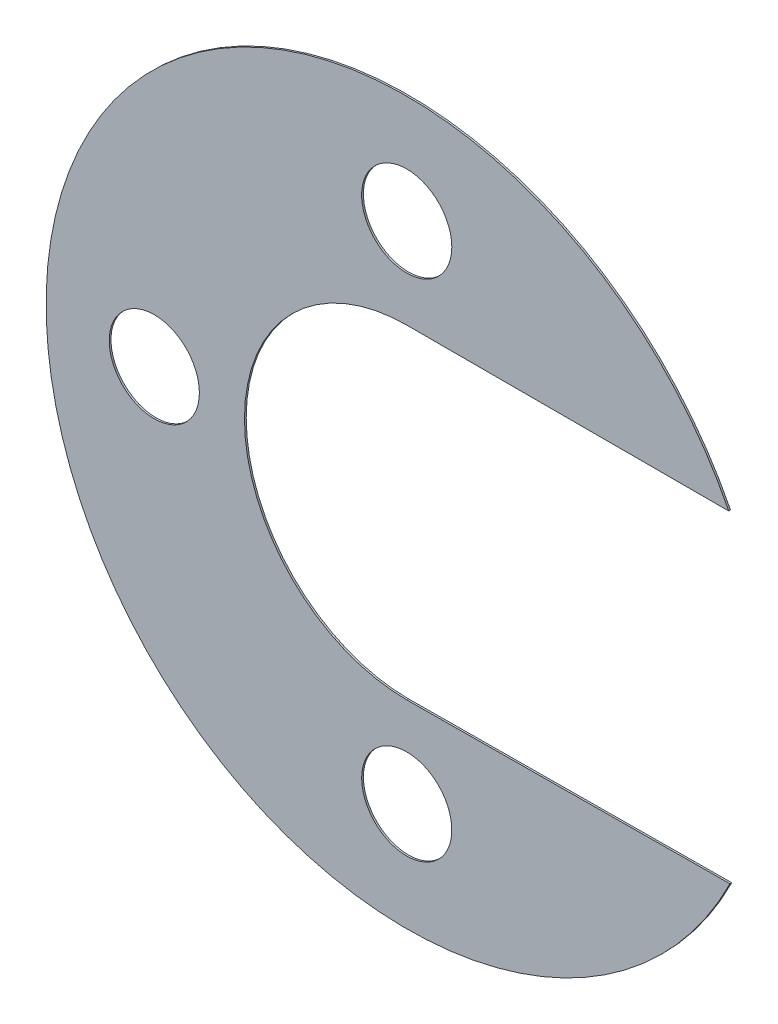
ISO-10303-21;
HEADER;
FILE_DESCRIPTION(('STEP AP214'),'2;1');
FILE_NAME('part.step','',(''),(''),'','','');
FILE_SCHEMA(('AUTOMOTIVE_DESIGN { 1 0 10303 214 1 1 1 1 }'));
ENDSEC;
DATA;
#1=APPLICATION_CONTEXT('core data for automotive mechanical design processes');
#2=APPLICATION_PROTOCOL_DEFINITION('international standard','automotive_design',2000,#1);
#3=PRODUCT_CONTEXT('',#1,'mechanical');
#4=PRODUCT('Part','Part','',(#3));
#5=PRODUCT_RELATED_PRODUCT_CATEGORY('part','',(#4));
#6=PRODUCT_DEFINITION_FORMATION('','',#4);
#7=PRODUCT_DEFINITION_CONTEXT('part definition',#1,'design');
#8=PRODUCT_DEFINITION('design','',#6,#7);
#9=PRODUCT_DEFINITION_SHAPE('','',#8);
#10=(LENGTH_UNIT() NAMED_UNIT(*) SI_UNIT(.MILLI.,.METRE.));
#11=(NAMED_UNIT(*) PLANE_ANGLE_UNIT() SI_UNIT($,.RADIAN.));
#12=(NAMED_UNIT(*) SI_UNIT($,.STERADIAN.) SOLID_ANGLE_UNIT());
#13=UNCERTAINTY_MEASURE_WITH_UNIT(LENGTH_MEASURE(1.E-05),#10,'distance_accuracy_value','');
#14=(GEOMETRIC_REPRESENTATION_CONTEXT(3) GLOBAL_UNCERTAINTY_ASSIGNED_CONTEXT((#13)) GLOBAL_UNIT_ASSIGNED_CONTEXT((#10,
#11,#12)) REPRESENTATION_CONTEXT('',''));
#15=CARTESIAN_POINT('',(0.,0.,0.));
#16=DIRECTION('',(0.,0.,1.));
#17=DIRECTION('',(1.,0.,0.));
#18=AXIS2_PLACEMENT_3D('',#15,#16,#17);
#19=CARTESIAN_POINT('',(-2045.28845561244,-1097.8705063361,5.));
#20=DIRECTION('',(0.,0.,1.));
#21=DIRECTION('',(1.,0.,0.));
#22=AXIS2_PLACEMENT_3D('',#19,#20,#21);
#23=PLANE('',#22);
#24=CARTESIAN_POINT('',(-2045.28845561244,-386.670506336097,5.));
#25=DIRECTION('',(0.,0.,1.));
#26=DIRECTION('',(1.,0.,0.));
#27=AXIS2_PLACEMENT_3D('',#24,#25,#26);
#28=CIRCLE('',#27,126.999999999998);
#29=CARTESIAN_POINT('',(-1918.28845561245,-386.670506336097,5.));
#30=VERTEX_POINT('',#29);
#31=EDGE_CURVE('E115',#30,#30,#28,.T.);
#32=ORIENTED_EDGE('',*,*,#31,.F.);
#33=EDGE_LOOP('',(#32));
#34=FACE_BOUND('',#33,.T.);
#35=CARTESIAN_POINT('',(-2045.28845561244,-1097.8705063361,5.));
#36=DIRECTION('',(0.,0.,-1.));
#37=DIRECTION('',(1.,0.,0.));
#38=AXIS2_PLACEMENT_3D('',#35,#36,#37);
#39=CIRCLE('',#38,457.2);
#40=CARTESIAN_POINT('',(-2045.28845561244,-1555.0705063361,5.));
#41=VERTEX_POINT('',#40);
#42=CARTESIAN_POINT('',(-2045.28845561244,-640.670506336096,5.));
#43=VERTEX_POINT('',#42);
#44=EDGE_CURVE('E85',#41,#43,#39,.T.);
#45=ORIENTED_EDGE('',*,*,#44,.T.);
#46=DIRECTION('',(1.,0.,0.));
#47=VECTOR('',#46,1.);
#48=CARTESIAN_POINT('',(-2045.28845561244,-640.670506336096,5.));
#49=LINE('',#48,#47);
#50=CARTESIAN_POINT('',(-1137.97144375827,-640.670506336096,5.));
#51=VERTEX_POINT('',#50);
#52=EDGE_CURVE('E80',#43,#51,#49,.T.);
#53=ORIENTED_EDGE('',*,*,#52,.T.);
#54=CARTESIAN_POINT('',(-2045.28845561244,-1097.8705063361,5.));
#55=DIRECTION('',(0.,0.,1.));
#56=DIRECTION('',(1.,0.,0.));
#57=AXIS2_PLACEMENT_3D('',#54,#55,#56);
#58=CIRCLE('',#57,1016.);
#59=CARTESIAN_POINT('',(-1134.61767517985,-1548.35328033116,5.));
#60=VERTEX_POINT('',#59);
#61=EDGE_CURVE('E83',#51,#60,#58,.T.);
#62=ORIENTED_EDGE('',*,*,#61,.T.);
#63=DIRECTION('',(-0.999972797463594,-0.00737592928605857,0.));
#64=VECTOR('',#63,1.);
#65=CARTESIAN_POINT('',(-1134.61767517985,-1548.35328033116,5.));
#66=LINE('',#65,#64);
#67=EDGE_CURVE('E50',#60,#41,#66,.T.);
#68=ORIENTED_EDGE('',*,*,#67,.T.);
#69=EDGE_LOOP('',(#45,#53,#62,#68));
#70=FACE_BOUND('',#69,.T.);
#71=CARTESIAN_POINT('',(-2045.28845561244,-1809.0705063361,5.));
#72=DIRECTION('',(0.,0.,1.));
#73=DIRECTION('',(-1.,0.,0.));
#74=AXIS2_PLACEMENT_3D('',#71,#72,#73);
#75=CIRCLE('',#74,126.999999999998);
#76=CARTESIAN_POINT('',(-2172.28845561244,-1809.0705063361,5.));
#77=VERTEX_POINT('',#76);
#78=EDGE_CURVE('E100',#77,#77,#75,.T.);
#79=ORIENTED_EDGE('',*,*,#78,.F.);
#80=EDGE_LOOP('',(#79));
#81=FACE_BOUND('',#80,.T.);
#82=CARTESIAN_POINT('',(-2756.48845561244,-1097.8705063361,5.));
#83=DIRECTION('',(0.,0.,1.));
#84=DIRECTION('',(1.,0.,0.));
#85=AXIS2_PLACEMENT_3D('',#82,#83,#84);
#86=CIRCLE('',#85,126.999999999997);
#87=CARTESIAN_POINT('',(-2629.48845561245,-1097.8705063361,5.));
#88=VERTEX_POINT('',#87);
#89=EDGE_CURVE('E121',#88,#88,#86,.T.);
#90=ORIENTED_EDGE('',*,*,#89,.F.);
#91=EDGE_LOOP('',(#90));
#92=FACE_BOUND('',#91,.T.);
#93=ADVANCED_FACE('F33',(#34,#70,#81,#92),#23,.T.);
#94=CARTESIAN_POINT('',(-2045.28845561244,-1097.8705063361,0.));
#95=DIRECTION('',(0.,0.,1.));
#96=DIRECTION('',(1.,0.,0.));
#97=AXIS2_PLACEMENT_3D('',#94,#95,#96);
#98=PLANE('',#97);
#99=CARTESIAN_POINT('',(-2045.28845561244,-1097.8705063361,0.));
#100=DIRECTION('',(0.,0.,-1.));
#101=DIRECTION('',(1.,0.,0.));
#102=AXIS2_PLACEMENT_3D('',#99,#100,#101);
#103=CIRCLE('',#102,457.2);
#104=CARTESIAN_POINT('',(-2045.28845561244,-1555.0705063361,0.));
#105=VERTEX_POINT('',#104);
#106=CARTESIAN_POINT('',(-2045.28845561244,-640.670506336096,0.));
#107=VERTEX_POINT('',#106);
#108=EDGE_CURVE('E97',#105,#107,#103,.T.);
#109=ORIENTED_EDGE('',*,*,#108,.F.);
#110=DIRECTION('',(-0.999972797463594,-0.00737592928605857,0.));
#111=VECTOR('',#110,1.);
#112=CARTESIAN_POINT('',(-1134.61767517985,-1548.35328033116,0.));
#113=LINE('',#112,#111);
#114=CARTESIAN_POINT('',(-1134.61767517985,-1548.35328033116,0.));
#115=VERTEX_POINT('',#114);
#116=EDGE_CURVE('E73',#115,#105,#113,.T.);
#117=ORIENTED_EDGE('',*,*,#116,.F.);
#118=CARTESIAN_POINT('',(-2045.28845561244,-1097.8705063361,0.));
#119=DIRECTION('',(0.,0.,1.));
#120=DIRECTION('',(1.,0.,0.));
#121=AXIS2_PLACEMENT_3D('',#118,#119,#120);
#122=CIRCLE('',#121,1016.);
#123=CARTESIAN_POINT('',(-1137.97144375827,-640.670506336096,0.));
#124=VERTEX_POINT('',#123);
#125=EDGE_CURVE('E67',#124,#115,#122,.T.);
#126=ORIENTED_EDGE('',*,*,#125,.F.);
#127=DIRECTION('',(1.,0.,0.));
#128=VECTOR('',#127,1.);
#129=CARTESIAN_POINT('',(-2045.28845561244,-640.670506336096,0.));
#130=LINE('',#129,#128);
#131=EDGE_CURVE('E89',#107,#124,#130,.T.);
#132=ORIENTED_EDGE('',*,*,#131,.F.);
#133=EDGE_LOOP('',(#109,#117,#126,#132));
#134=FACE_BOUND('',#133,.T.);
#135=CARTESIAN_POINT('',(-2045.28845561244,-1809.0705063361,0.));
#136=DIRECTION('',(0.,0.,1.));
#137=DIRECTION('',(-1.,0.,0.));
#138=AXIS2_PLACEMENT_3D('',#135,#136,#137);
#139=CIRCLE('',#138,126.999999999998);
#140=CARTESIAN_POINT('',(-2172.28845561244,-1809.0705063361,0.));
#141=VERTEX_POINT('',#140);
#142=EDGE_CURVE('E112',#141,#141,#139,.T.);
#143=ORIENTED_EDGE('',*,*,#142,.T.);
#144=EDGE_LOOP('',(#143));
#145=FACE_BOUND('',#144,.T.);
#146=CARTESIAN_POINT('',(-2045.28845561244,-386.670506336097,0.));
#147=DIRECTION('',(0.,0.,1.));
#148=DIRECTION('',(1.,0.,0.));
#149=AXIS2_PLACEMENT_3D('',#146,#147,#148);
#150=CIRCLE('',#149,126.999999999998);
#151=CARTESIAN_POINT('',(-1918.28845561245,-386.670506336097,0.));
#152=VERTEX_POINT('',#151);
#153=EDGE_CURVE('E118',#152,#152,#150,.T.);
#154=ORIENTED_EDGE('',*,*,#153,.T.);
#155=EDGE_LOOP('',(#154));
#156=FACE_BOUND('',#155,.T.);
#157=CARTESIAN_POINT('',(-2756.48845561244,-1097.8705063361,0.));
#158=DIRECTION('',(0.,0.,1.));
#159=DIRECTION('',(1.,0.,0.));
#160=AXIS2_PLACEMENT_3D('',#157,#158,#159);
#161=CIRCLE('',#160,126.999999999997);
#162=CARTESIAN_POINT('',(-2629.48845561245,-1097.8705063361,0.));
#163=VERTEX_POINT('',#162);
#164=EDGE_CURVE('E124',#163,#163,#161,.T.);
#165=ORIENTED_EDGE('',*,*,#164,.T.);
#166=EDGE_LOOP('',(#165));
#167=FACE_BOUND('',#166,.T.);
#168=ADVANCED_FACE('F108',(#134,#145,#156,#167),#98,.F.);
#169=CARTESIAN_POINT('',(-2045.28845561244,-1097.8705063361,5.));
#170=DIRECTION('',(0.,0.,-1.));
#171=DIRECTION('',(-1.,0.,0.));
#172=AXIS2_PLACEMENT_3D('',#169,#170,#171);
#173=CYLINDRICAL_SURFACE('',#172,457.2);
#174=ORIENTED_EDGE('',*,*,#108,.T.);
#175=DIRECTION('',(0.,0.,-1.));
#176=VECTOR('',#175,1.);
#177=CARTESIAN_POINT('',(-2045.28845561244,-640.670506336096,5.));
#178=LINE('',#177,#176);
#179=EDGE_CURVE('E11',#43,#107,#178,.T.);
#180=ORIENTED_EDGE('',*,*,#179,.F.);
#181=ORIENTED_EDGE('',*,*,#44,.F.);
#182=DIRECTION('',(0.,0.,-1.));
#183=VECTOR('',#182,1.);
#184=CARTESIAN_POINT('',(-2045.28845561244,-1555.0705063361,5.));
#185=LINE('',#184,#183);
#186=EDGE_CURVE('E93',#41,#105,#185,.T.);
#187=ORIENTED_EDGE('',*,*,#186,.T.);
#188=EDGE_LOOP('',(#174,#180,#181,#187));
#189=FACE_BOUND('',#188,.T.);
#190=ADVANCED_FACE('F35',(#189),#173,.F.);
#191=CARTESIAN_POINT('',(-2045.28845561244,-640.670506336096,5.));
#192=DIRECTION('',(0.,1.,0.));
#193=DIRECTION('',(0.,0.,1.));
#194=AXIS2_PLACEMENT_3D('',#191,#192,#193);
#195=PLANE('',#194);
#196=ORIENTED_EDGE('',*,*,#131,.T.);
#197=DIRECTION('',(0.,0.,-1.));
#198=VECTOR('',#197,1.);
#199=CARTESIAN_POINT('',(-1137.97144375827,-640.670506336096,5.));
#200=LINE('',#199,#198);
#201=EDGE_CURVE('E42',#51,#124,#200,.T.);
#202=ORIENTED_EDGE('',*,*,#201,.F.);
#203=ORIENTED_EDGE('',*,*,#52,.F.);
#204=ORIENTED_EDGE('',*,*,#179,.T.);
#205=EDGE_LOOP('',(#196,#202,#203,#204));
#206=FACE_BOUND('',#205,.T.);
#207=ADVANCED_FACE('F88',(#206),#195,.F.);
#208=CARTESIAN_POINT('',(-2045.28845561244,-1097.8705063361,5.));
#209=DIRECTION('',(0.,0.,-1.));
#210=DIRECTION('',(-1.,0.,0.));
#211=AXIS2_PLACEMENT_3D('',#208,#209,#210);
#212=CYLINDRICAL_SURFACE('',#211,1016.);
#213=ORIENTED_EDGE('',*,*,#125,.T.);
#214=DIRECTION('',(0.,0.,-1.));
#215=VECTOR('',#214,1.);
#216=CARTESIAN_POINT('',(-1134.61767517985,-1548.35328033116,5.));
#217=LINE('',#216,#215);
#218=EDGE_CURVE('E90',#60,#115,#217,.T.);
#219=ORIENTED_EDGE('',*,*,#218,.F.);
#220=ORIENTED_EDGE('',*,*,#61,.F.);
#221=ORIENTED_EDGE('',*,*,#201,.T.);
#222=EDGE_LOOP('',(#213,#219,#220,#221));
#223=FACE_BOUND('',#222,.T.);
#224=ADVANCED_FACE('F91',(#223),#212,.T.);
#225=CARTESIAN_POINT('',(-1134.61767517985,-1548.35328033116,5.));
#226=DIRECTION('',(0.00737592928605857,-0.999972797463594,0.));
#227=DIRECTION('',(0.999972797463595,0.00737592928605857,0.));
#228=AXIS2_PLACEMENT_3D('',#225,#226,#227);
#229=PLANE('',#228);
#230=ORIENTED_EDGE('',*,*,#116,.T.);
#231=ORIENTED_EDGE('',*,*,#186,.F.);
#232=ORIENTED_EDGE('',*,*,#67,.F.);
#233=ORIENTED_EDGE('',*,*,#218,.T.);
#234=EDGE_LOOP('',(#230,#231,#232,#233));
#235=FACE_BOUND('',#234,.T.);
#236=ADVANCED_FACE('F105',(#235),#229,.F.);
#237=CARTESIAN_POINT('',(-2045.28845561244,-1809.0705063361,5.));
#238=DIRECTION('',(0.,0.,-1.));
#239=DIRECTION('',(-1.,0.,0.));
#240=AXIS2_PLACEMENT_3D('',#237,#238,#239);
#241=CYLINDRICAL_SURFACE('',#240,126.999999999998);
#242=ORIENTED_EDGE('',*,*,#78,.T.);
#243=EDGE_LOOP('',(#242));
#244=FACE_BOUND('',#243,.T.);
#245=ORIENTED_EDGE('',*,*,#142,.F.);
#246=EDGE_LOOP('',(#245));
#247=FACE_BOUND('',#246,.T.);
#248=ADVANCED_FACE('F142',(#244,#247),#241,.F.);
#249=CARTESIAN_POINT('',(-2045.28845561244,-386.670506336097,5.));
#250=DIRECTION('',(0.,0.,-1.));
#251=DIRECTION('',(-1.,0.,0.));
#252=AXIS2_PLACEMENT_3D('',#249,#250,#251);
#253=CYLINDRICAL_SURFACE('',#252,126.999999999998);
#254=ORIENTED_EDGE('',*,*,#31,.T.);
#255=EDGE_LOOP('',(#254));
#256=FACE_BOUND('',#255,.T.);
#257=ORIENTED_EDGE('',*,*,#153,.F.);
#258=EDGE_LOOP('',(#257));
#259=FACE_BOUND('',#258,.T.);
#260=ADVANCED_FACE('F188',(#256,#259),#253,.F.);
#261=CARTESIAN_POINT('',(-2756.48845561244,-1097.8705063361,5.));
#262=DIRECTION('',(0.,0.,-1.));
#263=DIRECTION('',(-1.,0.,0.));
#264=AXIS2_PLACEMENT_3D('',#261,#262,#263);
#265=CYLINDRICAL_SURFACE('',#264,126.999999999997);
#266=ORIENTED_EDGE('',*,*,#89,.T.);
#267=EDGE_LOOP('',(#266));
#268=FACE_BOUND('',#267,.T.);
#269=ORIENTED_EDGE('',*,*,#164,.F.);
#270=EDGE_LOOP('',(#269));
#271=FACE_BOUND('',#270,.T.);
#272=ADVANCED_FACE('F130',(#268,#271),#265,.F.);
#273=CLOSED_SHELL('',(#93,#168,#190,#207,#224,#236,#248,#260,#272));
#274=MANIFOLD_SOLID_BREP('B2',#273);
#275=ADVANCED_BREP_SHAPE_REPRESENTATION('',(#18,#274),#14);
#276=SHAPE_DEFINITION_REPRESENTATION(#9,#275);
ENDSEC;
END-ISO-10303-21;
